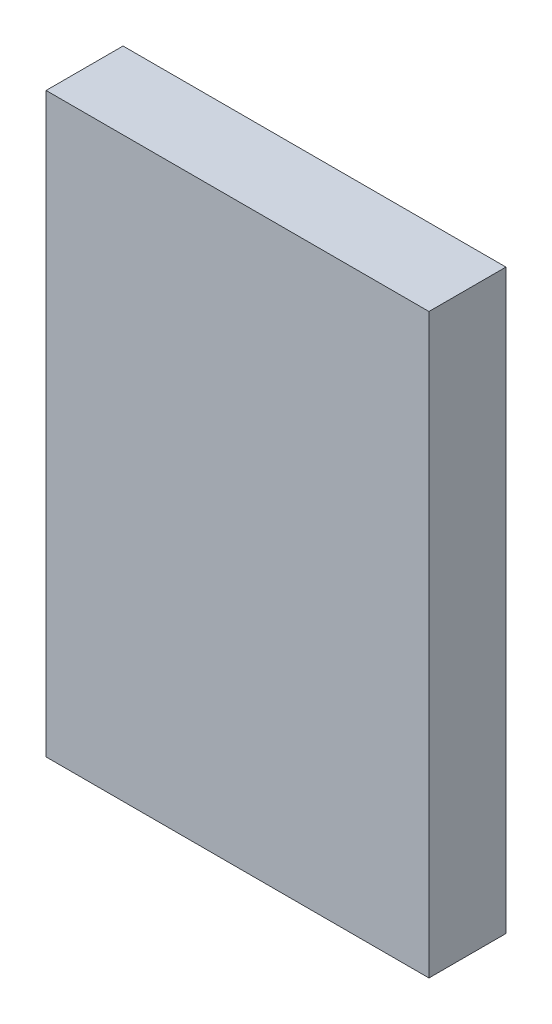
ISO-10303-21;
HEADER;
FILE_DESCRIPTION(('STEP AP214'),'2;1');
FILE_NAME('part.step','',(''),(''),'','','');
FILE_SCHEMA(('AUTOMOTIVE_DESIGN { 1 0 10303 214 1 1 1 1 }'));
ENDSEC;
DATA;
#1=APPLICATION_CONTEXT('core data for automotive mechanical design processes');
#2=APPLICATION_PROTOCOL_DEFINITION('international standard','automotive_design',2000,#1);
#3=PRODUCT_CONTEXT('',#1,'mechanical');
#4=PRODUCT('Part','Part','',(#3));
#5=PRODUCT_RELATED_PRODUCT_CATEGORY('part','',(#4));
#6=PRODUCT_DEFINITION_FORMATION('','',#4);
#7=PRODUCT_DEFINITION_CONTEXT('part definition',#1,'design');
#8=PRODUCT_DEFINITION('design','',#6,#7);
#9=PRODUCT_DEFINITION_SHAPE('','',#8);
#10=(LENGTH_UNIT() NAMED_UNIT(*) SI_UNIT(.MILLI.,.METRE.));
#11=(NAMED_UNIT(*) PLANE_ANGLE_UNIT() SI_UNIT($,.RADIAN.));
#12=(NAMED_UNIT(*) SI_UNIT($,.STERADIAN.) SOLID_ANGLE_UNIT());
#13=UNCERTAINTY_MEASURE_WITH_UNIT(LENGTH_MEASURE(1.E-05),#10,'distance_accuracy_value','');
#14=(GEOMETRIC_REPRESENTATION_CONTEXT(3) GLOBAL_UNCERTAINTY_ASSIGNED_CONTEXT((#13)) GLOBAL_UNIT_ASSIGNED_CONTEXT((#10,
#11,#12)) REPRESENTATION_CONTEXT('',''));
#15=CARTESIAN_POINT('',(0.,0.,0.));
#16=DIRECTION('',(0.,0.,1.));
#17=DIRECTION('',(1.,0.,0.));
#18=AXIS2_PLACEMENT_3D('',#15,#16,#17);
#19=CARTESIAN_POINT('',(-4.975,-7.5,2.));
#20=DIRECTION('',(1.,0.,0.));
#21=DIRECTION('',(0.,0.,-1.));
#22=AXIS2_PLACEMENT_3D('',#19,#20,#21);
#23=PLANE('',#22);
#24=DIRECTION('',(0.,-1.,0.));
#25=VECTOR('',#24,1.);
#26=CARTESIAN_POINT('',(-4.975,-7.5,0.));
#27=LINE('',#26,#25);
#28=CARTESIAN_POINT('',(-4.975,7.5,0.));
#29=VERTEX_POINT('',#28);
#30=CARTESIAN_POINT('',(-4.975,-7.5,0.));
#31=VERTEX_POINT('',#30);
#32=EDGE_CURVE('E95',#29,#31,#27,.T.);
#33=ORIENTED_EDGE('',*,*,#32,.T.);
#34=DIRECTION('',(0.,0.,-1.));
#35=VECTOR('',#34,1.);
#36=CARTESIAN_POINT('',(-4.975,-7.5,2.));
#37=LINE('',#36,#35);
#38=CARTESIAN_POINT('',(-4.975,-7.5,2.));
#39=VERTEX_POINT('',#38);
#40=EDGE_CURVE('E11',#39,#31,#37,.T.);
#41=ORIENTED_EDGE('',*,*,#40,.F.);
#42=DIRECTION('',(0.,-1.,0.));
#43=VECTOR('',#42,1.);
#44=CARTESIAN_POINT('',(-4.975,-7.5,2.));
#45=LINE('',#44,#43);
#46=CARTESIAN_POINT('',(-4.975,7.5,2.));
#47=VERTEX_POINT('',#46);
#48=EDGE_CURVE('E83',#47,#39,#45,.T.);
#49=ORIENTED_EDGE('',*,*,#48,.F.);
#50=DIRECTION('',(0.,0.,-1.));
#51=VECTOR('',#50,1.);
#52=CARTESIAN_POINT('',(-4.975,7.5,2.));
#53=LINE('',#52,#51);
#54=EDGE_CURVE('E91',#47,#29,#53,.T.);
#55=ORIENTED_EDGE('',*,*,#54,.T.);
#56=EDGE_LOOP('',(#33,#41,#49,#55));
#57=FACE_BOUND('',#56,.T.);
#58=ADVANCED_FACE('F32',(#57),#23,.F.);
#59=CARTESIAN_POINT('',(4.975,-7.5,2.));
#60=DIRECTION('',(0.,1.,0.));
#61=DIRECTION('',(-1.,0.,0.));
#62=AXIS2_PLACEMENT_3D('',#59,#60,#61);
#63=PLANE('',#62);
#64=DIRECTION('',(1.,0.,0.));
#65=VECTOR('',#64,1.);
#66=CARTESIAN_POINT('',(4.975,-7.5,0.));
#67=LINE('',#66,#65);
#68=CARTESIAN_POINT('',(4.975,-7.5,0.));
#69=VERTEX_POINT('',#68);
#70=EDGE_CURVE('E87',#31,#69,#67,.T.);
#71=ORIENTED_EDGE('',*,*,#70,.T.);
#72=DIRECTION('',(0.,0.,-1.));
#73=VECTOR('',#72,1.);
#74=CARTESIAN_POINT('',(4.975,-7.5,2.));
#75=LINE('',#74,#73);
#76=CARTESIAN_POINT('',(4.975,-7.5,2.));
#77=VERTEX_POINT('',#76);
#78=EDGE_CURVE('E40',#77,#69,#75,.T.);
#79=ORIENTED_EDGE('',*,*,#78,.F.);
#80=DIRECTION('',(1.,0.,0.));
#81=VECTOR('',#80,1.);
#82=CARTESIAN_POINT('',(4.975,-7.5,2.));
#83=LINE('',#82,#81);
#84=EDGE_CURVE('E78',#39,#77,#83,.T.);
#85=ORIENTED_EDGE('',*,*,#84,.F.);
#86=ORIENTED_EDGE('',*,*,#40,.T.);
#87=EDGE_LOOP('',(#71,#79,#85,#86));
#88=FACE_BOUND('',#87,.T.);
#89=ADVANCED_FACE('F86',(#88),#63,.F.);
#90=CARTESIAN_POINT('',(4.975,-7.5,2.));
#91=DIRECTION('',(-1.,0.,0.));
#92=DIRECTION('',(0.,0.,1.));
#93=AXIS2_PLACEMENT_3D('',#90,#91,#92);
#94=PLANE('',#93);
#95=DIRECTION('',(0.,1.,0.));
#96=VECTOR('',#95,1.);
#97=CARTESIAN_POINT('',(4.975,-7.5,0.));
#98=LINE('',#97,#96);
#99=CARTESIAN_POINT('',(4.975,7.5,0.));
#100=VERTEX_POINT('',#99);
#101=EDGE_CURVE('E65',#69,#100,#98,.T.);
#102=ORIENTED_EDGE('',*,*,#101,.T.);
#103=DIRECTION('',(0.,0.,-1.));
#104=VECTOR('',#103,1.);
#105=CARTESIAN_POINT('',(4.975,7.5,2.));
#106=LINE('',#105,#104);
#107=CARTESIAN_POINT('',(4.975,7.5,2.));
#108=VERTEX_POINT('',#107);
#109=EDGE_CURVE('E88',#108,#100,#106,.T.);
#110=ORIENTED_EDGE('',*,*,#109,.F.);
#111=DIRECTION('',(0.,1.,0.));
#112=VECTOR('',#111,1.);
#113=CARTESIAN_POINT('',(4.975,-7.5,2.));
#114=LINE('',#113,#112);
#115=EDGE_CURVE('E81',#77,#108,#114,.T.);
#116=ORIENTED_EDGE('',*,*,#115,.F.);
#117=ORIENTED_EDGE('',*,*,#78,.T.);
#118=EDGE_LOOP('',(#102,#110,#116,#117));
#119=FACE_BOUND('',#118,.T.);
#120=ADVANCED_FACE('F89',(#119),#94,.F.);
#121=CARTESIAN_POINT('',(4.975,7.5,2.));
#122=DIRECTION('',(0.,-1.,0.));
#123=DIRECTION('',(1.,0.,0.));
#124=AXIS2_PLACEMENT_3D('',#121,#122,#123);
#125=PLANE('',#124);
#126=DIRECTION('',(-1.,0.,0.));
#127=VECTOR('',#126,1.);
#128=CARTESIAN_POINT('',(4.975,7.5,0.));
#129=LINE('',#128,#127);
#130=EDGE_CURVE('E71',#100,#29,#129,.T.);
#131=ORIENTED_EDGE('',*,*,#130,.T.);
#132=ORIENTED_EDGE('',*,*,#54,.F.);
#133=DIRECTION('',(-1.,0.,0.));
#134=VECTOR('',#133,1.);
#135=CARTESIAN_POINT('',(4.975,7.5,2.));
#136=LINE('',#135,#134);
#137=EDGE_CURVE('E48',#108,#47,#136,.T.);
#138=ORIENTED_EDGE('',*,*,#137,.F.);
#139=ORIENTED_EDGE('',*,*,#109,.T.);
#140=EDGE_LOOP('',(#131,#132,#138,#139));
#141=FACE_BOUND('',#140,.T.);
#142=ADVANCED_FACE('F102',(#141),#125,.F.);
#143=CARTESIAN_POINT('',(0.,0.,2.));
#144=DIRECTION('',(0.,0.,1.));
#145=DIRECTION('',(1.,0.,0.));
#146=AXIS2_PLACEMENT_3D('',#143,#144,#145);
#147=PLANE('',#146);
#148=ORIENTED_EDGE('',*,*,#48,.T.);
#149=ORIENTED_EDGE('',*,*,#84,.T.);
#150=ORIENTED_EDGE('',*,*,#115,.T.);
#151=ORIENTED_EDGE('',*,*,#137,.T.);
#152=EDGE_LOOP('',(#148,#149,#150,#151));
#153=FACE_BOUND('',#152,.T.);
#154=ADVANCED_FACE('F79',(#153),#147,.T.);
#155=CARTESIAN_POINT('',(0.,0.,0.));
#156=DIRECTION('',(0.,0.,1.));
#157=DIRECTION('',(1.,0.,0.));
#158=AXIS2_PLACEMENT_3D('',#155,#156,#157);
#159=PLANE('',#158);
#160=ORIENTED_EDGE('',*,*,#32,.F.);
#161=ORIENTED_EDGE('',*,*,#130,.F.);
#162=ORIENTED_EDGE('',*,*,#101,.F.);
#163=ORIENTED_EDGE('',*,*,#70,.F.);
#164=EDGE_LOOP('',(#160,#161,#162,#163));
#165=FACE_BOUND('',#164,.T.);
#166=ADVANCED_FACE('F105',(#165),#159,.F.);
#167=CLOSED_SHELL('',(#58,#89,#120,#142,#154,#166));
#168=MANIFOLD_SOLID_BREP('B2',#167);
#169=ADVANCED_BREP_SHAPE_REPRESENTATION('',(#18,#168),#14);
#170=SHAPE_DEFINITION_REPRESENTATION(#9,#169);
ENDSEC;
END-ISO-10303-21;
